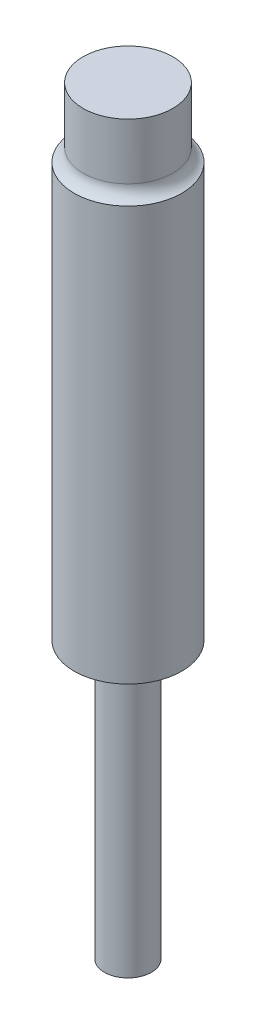
ISO-10303-21;
HEADER;
FILE_DESCRIPTION(('STEP AP214'),'2;1');
FILE_NAME('part.step','',(''),(''),'','','');
FILE_SCHEMA(('AUTOMOTIVE_DESIGN { 1 0 10303 214 1 1 1 1 }'));
ENDSEC;
DATA;
#1=APPLICATION_CONTEXT('core data for automotive mechanical design processes');
#2=APPLICATION_PROTOCOL_DEFINITION('international standard','automotive_design',2000,#1);
#3=PRODUCT_CONTEXT('',#1,'mechanical');
#4=PRODUCT('Part','Part','',(#3));
#5=PRODUCT_RELATED_PRODUCT_CATEGORY('part','',(#4));
#6=PRODUCT_DEFINITION_FORMATION('','',#4);
#7=PRODUCT_DEFINITION_CONTEXT('part definition',#1,'design');
#8=PRODUCT_DEFINITION('design','',#6,#7);
#9=PRODUCT_DEFINITION_SHAPE('','',#8);
#10=(LENGTH_UNIT() NAMED_UNIT(*) SI_UNIT(.MILLI.,.METRE.));
#11=(NAMED_UNIT(*) PLANE_ANGLE_UNIT() SI_UNIT($,.RADIAN.));
#12=(NAMED_UNIT(*) SI_UNIT($,.STERADIAN.) SOLID_ANGLE_UNIT());
#13=UNCERTAINTY_MEASURE_WITH_UNIT(LENGTH_MEASURE(1.E-05),#10,'distance_accuracy_value','');
#14=(GEOMETRIC_REPRESENTATION_CONTEXT(3) GLOBAL_UNCERTAINTY_ASSIGNED_CONTEXT((#13)) GLOBAL_UNIT_ASSIGNED_CONTEXT((#10,
#11,#12)) REPRESENTATION_CONTEXT('',''));
#15=CARTESIAN_POINT('',(0.,0.,0.));
#16=DIRECTION('',(0.,0.,1.));
#17=DIRECTION('',(1.,0.,0.));
#18=AXIS2_PLACEMENT_3D('',#15,#16,#17);
#19=CARTESIAN_POINT('',(0.,30.,0.));
#20=DIRECTION('',(0.,-1.,0.));
#21=DIRECTION('',(0.,0.,-1.));
#22=AXIS2_PLACEMENT_3D('',#19,#20,#21);
#23=CYLINDRICAL_SURFACE('',#22,3.9);
#24=CARTESIAN_POINT('',(0.,30.,0.));
#25=DIRECTION('',(0.,1.,0.));
#26=DIRECTION('',(0.,0.,1.));
#27=AXIS2_PLACEMENT_3D('',#24,#25,#26);
#28=CIRCLE('',#27,3.9);
#29=CARTESIAN_POINT('',(0.,30.,3.9));
#30=VERTEX_POINT('',#29);
#31=EDGE_CURVE('E46',#30,#30,#28,.T.);
#32=ORIENTED_EDGE('',*,*,#31,.F.);
#33=EDGE_LOOP('',(#32));
#34=FACE_BOUND('',#33,.T.);
#35=CARTESIAN_POINT('',(0.,0.,0.));
#36=DIRECTION('',(0.,1.,0.));
#37=DIRECTION('',(0.,0.,1.));
#38=AXIS2_PLACEMENT_3D('',#35,#36,#37);
#39=CIRCLE('',#38,3.9);
#40=CARTESIAN_POINT('',(0.,0.,3.9));
#41=VERTEX_POINT('',#40);
#42=EDGE_CURVE('E52',#41,#41,#39,.T.);
#43=ORIENTED_EDGE('',*,*,#42,.T.);
#44=EDGE_LOOP('',(#43));
#45=FACE_BOUND('',#44,.T.);
#46=ADVANCED_FACE('F35',(#34,#45),#23,.T.);
#47=CARTESIAN_POINT('',(0.,0.,0.));
#48=DIRECTION('',(0.,1.,0.));
#49=DIRECTION('',(0.,0.,1.));
#50=AXIS2_PLACEMENT_3D('',#47,#48,#49);
#51=PLANE('',#50);
#52=CARTESIAN_POINT('',(0.,0.,0.));
#53=DIRECTION('',(0.,-1.,0.));
#54=DIRECTION('',(0.,0.,-1.));
#55=AXIS2_PLACEMENT_3D('',#52,#53,#54);
#56=CIRCLE('',#55,1.7);
#57=CARTESIAN_POINT('',(0.,0.,-1.7));
#58=VERTEX_POINT('',#57);
#59=EDGE_CURVE('E42',#58,#58,#56,.T.);
#60=ORIENTED_EDGE('',*,*,#59,.F.);
#61=EDGE_LOOP('',(#60));
#62=FACE_BOUND('',#61,.T.);
#63=ORIENTED_EDGE('',*,*,#42,.F.);
#64=EDGE_LOOP('',(#63));
#65=FACE_BOUND('',#64,.T.);
#66=ADVANCED_FACE('F63',(#62,#65),#51,.F.);
#67=CARTESIAN_POINT('',(0.,35.,0.));
#68=DIRECTION('',(0.,-1.,0.));
#69=DIRECTION('',(0.,0.,-1.));
#70=AXIS2_PLACEMENT_3D('',#67,#68,#69);
#71=CYLINDRICAL_SURFACE('',#70,3.25);
#72=CARTESIAN_POINT('',(0.,30.9367496997598,0.));
#73=DIRECTION('',(0.,-1.,0.));
#74=DIRECTION('',(0.,0.,-1.));
#75=AXIS2_PLACEMENT_3D('',#72,#73,#74);
#76=CIRCLE('',#75,3.25);
#77=CARTESIAN_POINT('',(0.,30.9367496997598,-3.25));
#78=VERTEX_POINT('',#77);
#79=EDGE_CURVE('E10',#78,#78,#76,.F.);
#80=ORIENTED_EDGE('',*,*,#79,.T.);
#81=EDGE_LOOP('',(#80));
#82=FACE_BOUND('',#81,.T.);
#83=CARTESIAN_POINT('',(0.,35.,0.));
#84=DIRECTION('',(0.,1.,0.));
#85=DIRECTION('',(0.,0.,1.));
#86=AXIS2_PLACEMENT_3D('',#83,#84,#85);
#87=CIRCLE('',#86,3.25);
#88=CARTESIAN_POINT('',(0.,35.,3.25));
#89=VERTEX_POINT('',#88);
#90=EDGE_CURVE('E57',#89,#89,#87,.T.);
#91=ORIENTED_EDGE('',*,*,#90,.F.);
#92=EDGE_LOOP('',(#91));
#93=FACE_BOUND('',#92,.T.);
#94=ADVANCED_FACE('F65',(#82,#93),#71,.T.);
#95=CARTESIAN_POINT('',(0.,35.,0.));
#96=DIRECTION('',(0.,1.,0.));
#97=DIRECTION('',(0.,0.,1.));
#98=AXIS2_PLACEMENT_3D('',#95,#96,#97);
#99=PLANE('',#98);
#100=ORIENTED_EDGE('',*,*,#90,.T.);
#101=EDGE_LOOP('',(#100));
#102=FACE_BOUND('',#101,.T.);
#103=ADVANCED_FACE('F72',(#102),#99,.T.);
#104=CARTESIAN_POINT('',(0.,-20.,0.));
#105=DIRECTION('',(0.,1.,0.));
#106=DIRECTION('',(0.,0.,1.));
#107=AXIS2_PLACEMENT_3D('',#104,#105,#106);
#108=CYLINDRICAL_SURFACE('',#107,1.7);
#109=CARTESIAN_POINT('',(0.,-20.,0.));
#110=DIRECTION('',(0.,-1.,0.));
#111=DIRECTION('',(0.,0.,-1.));
#112=AXIS2_PLACEMENT_3D('',#109,#110,#111);
#113=CIRCLE('',#112,1.7);
#114=CARTESIAN_POINT('',(0.,-20.,-1.7));
#115=VERTEX_POINT('',#114);
#116=EDGE_CURVE('E56',#115,#115,#113,.T.);
#117=ORIENTED_EDGE('',*,*,#116,.F.);
#118=EDGE_LOOP('',(#117));
#119=FACE_BOUND('',#118,.T.);
#120=ORIENTED_EDGE('',*,*,#59,.T.);
#121=EDGE_LOOP('',(#120));
#122=FACE_BOUND('',#121,.T.);
#123=ADVANCED_FACE('F78',(#119,#122),#108,.T.);
#124=CARTESIAN_POINT('',(0.,-20.,0.));
#125=DIRECTION('',(0.,-1.,0.));
#126=DIRECTION('',(0.,0.,-1.));
#127=AXIS2_PLACEMENT_3D('',#124,#125,#126);
#128=PLANE('',#127);
#129=ORIENTED_EDGE('',*,*,#116,.T.);
#130=EDGE_LOOP('',(#129));
#131=FACE_BOUND('',#130,.T.);
#132=ADVANCED_FACE('F82',(#131),#128,.T.);
#133=CARTESIAN_POINT('',(0.,30.9367496997598,0.));
#134=DIRECTION('',(0.,-1.,0.));
#135=DIRECTION('',(0.,0.,-1.));
#136=AXIS2_PLACEMENT_3D('',#133,#134,#135);
#137=TOROIDAL_SURFACE('',#136,4.25,1.);
#138=ORIENTED_EDGE('',*,*,#31,.T.);
#139=EDGE_LOOP('',(#138));
#140=FACE_BOUND('',#139,.T.);
#141=ORIENTED_EDGE('',*,*,#79,.F.);
#142=EDGE_LOOP('',(#141));
#143=FACE_BOUND('',#142,.T.);
#144=ADVANCED_FACE('F37',(#140,#143),#137,.F.);
#145=CLOSED_SHELL('',(#46,#66,#94,#103,#123,#132,#144));
#146=MANIFOLD_SOLID_BREP('B2',#145);
#147=ADVANCED_BREP_SHAPE_REPRESENTATION('',(#18,#146),#14);
#148=SHAPE_DEFINITION_REPRESENTATION(#9,#147);
ENDSEC;
END-ISO-10303-21;
